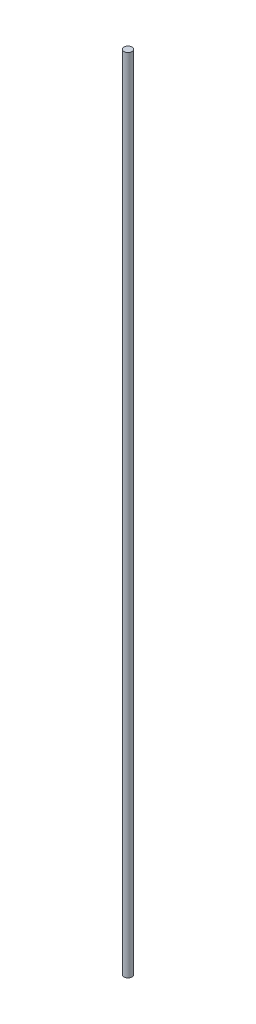
ISO-10303-21;
HEADER;
FILE_DESCRIPTION(('STEP AP214'),'2;1');
FILE_NAME('part.step','',(''),(''),'','','');
FILE_SCHEMA(('AUTOMOTIVE_DESIGN { 1 0 10303 214 1 1 1 1 }'));
ENDSEC;
DATA;
#1=APPLICATION_CONTEXT('core data for automotive mechanical design processes');
#2=APPLICATION_PROTOCOL_DEFINITION('international standard','automotive_design',2000,#1);
#3=PRODUCT_CONTEXT('',#1,'mechanical');
#4=PRODUCT('Part','Part','',(#3));
#5=PRODUCT_RELATED_PRODUCT_CATEGORY('part','',(#4));
#6=PRODUCT_DEFINITION_FORMATION('','',#4);
#7=PRODUCT_DEFINITION_CONTEXT('part definition',#1,'design');
#8=PRODUCT_DEFINITION('design','',#6,#7);
#9=PRODUCT_DEFINITION_SHAPE('','',#8);
#10=(LENGTH_UNIT() NAMED_UNIT(*) SI_UNIT(.MILLI.,.METRE.));
#11=(NAMED_UNIT(*) PLANE_ANGLE_UNIT() SI_UNIT($,.RADIAN.));
#12=(NAMED_UNIT(*) SI_UNIT($,.STERADIAN.) SOLID_ANGLE_UNIT());
#13=UNCERTAINTY_MEASURE_WITH_UNIT(LENGTH_MEASURE(1.E-05),#10,'distance_accuracy_value','');
#14=(GEOMETRIC_REPRESENTATION_CONTEXT(3) GLOBAL_UNCERTAINTY_ASSIGNED_CONTEXT((#13)) GLOBAL_UNIT_ASSIGNED_CONTEXT((#10,
#11,#12)) REPRESENTATION_CONTEXT('',''));
#15=CARTESIAN_POINT('',(0.,0.,0.));
#16=DIRECTION('',(0.,0.,1.));
#17=DIRECTION('',(1.,0.,0.));
#18=AXIS2_PLACEMENT_3D('',#15,#16,#17);
#19=CARTESIAN_POINT('',(0.,400.,0.));
#20=DIRECTION('',(0.,-1.,0.));
#21=DIRECTION('',(0.,0.,-1.));
#22=AXIS2_PLACEMENT_3D('',#19,#20,#21);
#23=CYLINDRICAL_SURFACE('',#22,2.);
#24=CARTESIAN_POINT('',(0.,400.,0.));
#25=DIRECTION('',(0.,1.,0.));
#26=DIRECTION('',(0.,0.,1.));
#27=AXIS2_PLACEMENT_3D('',#24,#25,#26);
#28=CIRCLE('',#27,2.);
#29=CARTESIAN_POINT('',(0.,400.,2.));
#30=VERTEX_POINT('',#29);
#31=EDGE_CURVE('E10',#30,#30,#28,.T.);
#32=ORIENTED_EDGE('',*,*,#31,.F.);
#33=EDGE_LOOP('',(#32));
#34=FACE_BOUND('',#33,.T.);
#35=CARTESIAN_POINT('',(0.,0.,0.));
#36=DIRECTION('',(0.,1.,0.));
#37=DIRECTION('',(0.,0.,1.));
#38=AXIS2_PLACEMENT_3D('',#35,#36,#37);
#39=CIRCLE('',#38,2.);
#40=CARTESIAN_POINT('',(0.,0.,2.));
#41=VERTEX_POINT('',#40);
#42=EDGE_CURVE('E44',#41,#41,#39,.T.);
#43=ORIENTED_EDGE('',*,*,#42,.T.);
#44=EDGE_LOOP('',(#43));
#45=FACE_BOUND('',#44,.T.);
#46=ADVANCED_FACE('F41',(#34,#45),#23,.T.);
#47=CARTESIAN_POINT('',(0.,400.,0.));
#48=DIRECTION('',(0.,1.,0.));
#49=DIRECTION('',(0.,0.,1.));
#50=AXIS2_PLACEMENT_3D('',#47,#48,#49);
#51=PLANE('',#50);
#52=ORIENTED_EDGE('',*,*,#31,.T.);
#53=EDGE_LOOP('',(#52));
#54=FACE_BOUND('',#53,.T.);
#55=ADVANCED_FACE('F56',(#54),#51,.T.);
#56=CARTESIAN_POINT('',(0.,0.,0.));
#57=DIRECTION('',(0.,1.,0.));
#58=DIRECTION('',(0.,0.,1.));
#59=AXIS2_PLACEMENT_3D('',#56,#57,#58);
#60=PLANE('',#59);
#61=ORIENTED_EDGE('',*,*,#42,.F.);
#62=EDGE_LOOP('',(#61));
#63=FACE_BOUND('',#62,.T.);
#64=ADVANCED_FACE('F54',(#63),#60,.F.);
#65=CLOSED_SHELL('',(#46,#55,#64));
#66=MANIFOLD_SOLID_BREP('B2',#65);
#67=ADVANCED_BREP_SHAPE_REPRESENTATION('',(#18,#66),#14);
#68=SHAPE_DEFINITION_REPRESENTATION(#9,#67);
ENDSEC;
END-ISO-10303-21;
